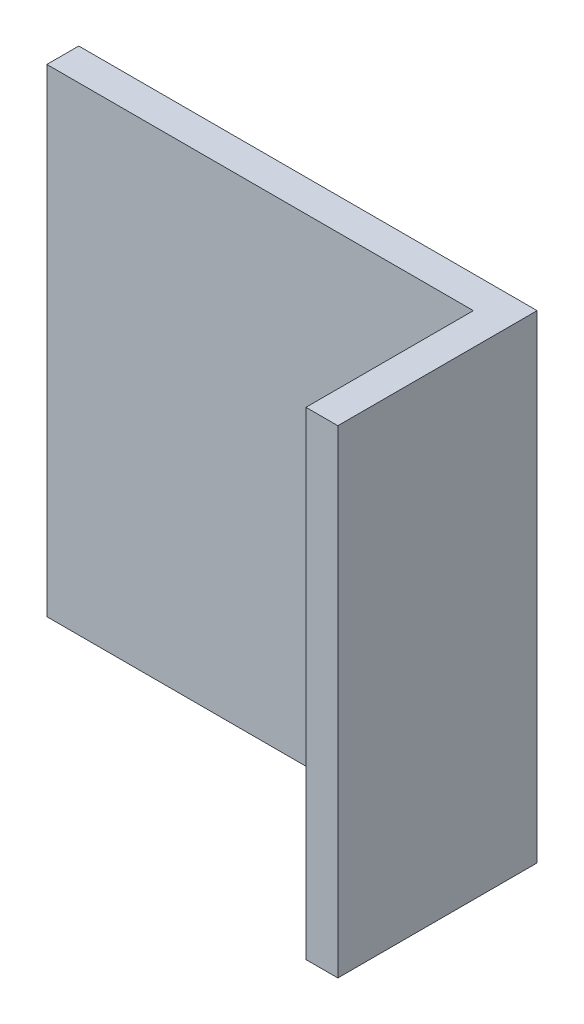
ISO-10303-21;
HEADER;
FILE_DESCRIPTION(('STEP AP214'),'2;1');
FILE_NAME('part.step','',(''),(''),'','','');
FILE_SCHEMA(('AUTOMOTIVE_DESIGN { 1 0 10303 214 1 1 1 1 }'));
ENDSEC;
DATA;
#1=APPLICATION_CONTEXT('core data for automotive mechanical design processes');
#2=APPLICATION_PROTOCOL_DEFINITION('international standard','automotive_design',2000,#1);
#3=PRODUCT_CONTEXT('',#1,'mechanical');
#4=PRODUCT('Part','Part','',(#3));
#5=PRODUCT_RELATED_PRODUCT_CATEGORY('part','',(#4));
#6=PRODUCT_DEFINITION_FORMATION('','',#4);
#7=PRODUCT_DEFINITION_CONTEXT('part definition',#1,'design');
#8=PRODUCT_DEFINITION('design','',#6,#7);
#9=PRODUCT_DEFINITION_SHAPE('','',#8);
#10=(LENGTH_UNIT() NAMED_UNIT(*) SI_UNIT(.MILLI.,.METRE.));
#11=(NAMED_UNIT(*) PLANE_ANGLE_UNIT() SI_UNIT($,.RADIAN.));
#12=(NAMED_UNIT(*) SI_UNIT($,.STERADIAN.) SOLID_ANGLE_UNIT());
#13=UNCERTAINTY_MEASURE_WITH_UNIT(LENGTH_MEASURE(1.E-05),#10,'distance_accuracy_value','');
#14=(GEOMETRIC_REPRESENTATION_CONTEXT(3) GLOBAL_UNCERTAINTY_ASSIGNED_CONTEXT((#13)) GLOBAL_UNIT_ASSIGNED_CONTEXT((#10,
#11,#12)) REPRESENTATION_CONTEXT('',''));
#15=CARTESIAN_POINT('',(0.,0.,0.));
#16=DIRECTION('',(0.,0.,1.));
#17=DIRECTION('',(1.,0.,0.));
#18=AXIS2_PLACEMENT_3D('',#15,#16,#17);
#19=CARTESIAN_POINT('',(-115.,-120.,16.));
#20=DIRECTION('',(1.,0.,0.));
#21=DIRECTION('',(0.,0.,-1.));
#22=AXIS2_PLACEMENT_3D('',#19,#20,#21);
#23=PLANE('',#22);
#24=DIRECTION('',(0.,-1.,0.));
#25=VECTOR('',#24,1.);
#26=CARTESIAN_POINT('',(-115.,-120.,0.));
#27=LINE('',#26,#25);
#28=CARTESIAN_POINT('',(-115.,120.,0.));
#29=VERTEX_POINT('',#28);
#30=CARTESIAN_POINT('',(-115.,-120.,0.));
#31=VERTEX_POINT('',#30);
#32=EDGE_CURVE('E92',#29,#31,#27,.T.);
#33=ORIENTED_EDGE('',*,*,#32,.T.);
#34=DIRECTION('',(0.,0.,-1.));
#35=VECTOR('',#34,1.);
#36=CARTESIAN_POINT('',(-115.,-120.,16.));
#37=LINE('',#36,#35);
#38=CARTESIAN_POINT('',(-115.,-120.,16.));
#39=VERTEX_POINT('',#38);
#40=EDGE_CURVE('E11',#39,#31,#37,.T.);
#41=ORIENTED_EDGE('',*,*,#40,.F.);
#42=DIRECTION('',(0.,-1.,0.));
#43=VECTOR('',#42,1.);
#44=CARTESIAN_POINT('',(-115.,-120.,16.));
#45=LINE('',#44,#43);
#46=CARTESIAN_POINT('',(-115.,120.,16.));
#47=VERTEX_POINT('',#46);
#48=EDGE_CURVE('E86',#47,#39,#45,.T.);
#49=ORIENTED_EDGE('',*,*,#48,.F.);
#50=DIRECTION('',(0.,0.,-1.));
#51=VECTOR('',#50,1.);
#52=CARTESIAN_POINT('',(-115.,120.,16.));
#53=LINE('',#52,#51);
#54=EDGE_CURVE('E78',#47,#29,#53,.T.);
#55=ORIENTED_EDGE('',*,*,#54,.T.);
#56=EDGE_LOOP('',(#33,#41,#49,#55));
#57=FACE_BOUND('',#56,.T.);
#58=ADVANCED_FACE('F34',(#57),#23,.F.);
#59=CARTESIAN_POINT('',(115.,-120.,16.));
#60=DIRECTION('',(0.,1.,0.));
#61=DIRECTION('',(-1.,0.,0.));
#62=AXIS2_PLACEMENT_3D('',#59,#60,#61);
#63=PLANE('',#62);
#64=DIRECTION('',(1.,0.,0.));
#65=VECTOR('',#64,1.);
#66=CARTESIAN_POINT('',(115.,-120.,0.));
#67=LINE('',#66,#65);
#68=CARTESIAN_POINT('',(115.,-120.,0.));
#69=VERTEX_POINT('',#68);
#70=EDGE_CURVE('E95',#31,#69,#67,.T.);
#71=ORIENTED_EDGE('',*,*,#70,.T.);
#72=DIRECTION('',(0.,0.,-1.));
#73=VECTOR('',#72,1.);
#74=CARTESIAN_POINT('',(115.,-120.,16.));
#75=LINE('',#74,#73);
#76=CARTESIAN_POINT('',(115.,-120.,100.));
#77=VERTEX_POINT('',#76);
#78=EDGE_CURVE('E42',#77,#69,#75,.T.);
#79=ORIENTED_EDGE('',*,*,#78,.F.);
#80=DIRECTION('',(1.,0.,0.));
#81=VECTOR('',#80,1.);
#82=CARTESIAN_POINT('',(115.,-120.,100.));
#83=LINE('',#82,#81);
#84=CARTESIAN_POINT('',(99.,-120.,100.));
#85=VERTEX_POINT('',#84);
#86=EDGE_CURVE('E117',#85,#77,#83,.T.);
#87=ORIENTED_EDGE('',*,*,#86,.F.);
#88=DIRECTION('',(0.,0.,-1.));
#89=VECTOR('',#88,1.);
#90=CARTESIAN_POINT('',(99.,-120.,100.));
#91=LINE('',#90,#89);
#92=CARTESIAN_POINT('',(99.,-120.,16.));
#93=VERTEX_POINT('',#92);
#94=EDGE_CURVE('E100',#85,#93,#91,.T.);
#95=ORIENTED_EDGE('',*,*,#94,.T.);
#96=DIRECTION('',(1.,0.,0.));
#97=VECTOR('',#96,1.);
#98=CARTESIAN_POINT('',(115.,-120.,16.));
#99=LINE('',#98,#97);
#100=EDGE_CURVE('E109',#39,#93,#99,.T.);
#101=ORIENTED_EDGE('',*,*,#100,.F.);
#102=ORIENTED_EDGE('',*,*,#40,.T.);
#103=EDGE_LOOP('',(#71,#79,#87,#95,#101,#102));
#104=FACE_BOUND('',#103,.T.);
#105=ADVANCED_FACE('F154',(#104),#63,.F.);
#106=CARTESIAN_POINT('',(115.,-120.,16.));
#107=DIRECTION('',(-1.,0.,0.));
#108=DIRECTION('',(0.,0.,1.));
#109=AXIS2_PLACEMENT_3D('',#106,#107,#108);
#110=PLANE('',#109);
#111=DIRECTION('',(0.,1.,0.));
#112=VECTOR('',#111,1.);
#113=CARTESIAN_POINT('',(115.,-120.,0.));
#114=LINE('',#113,#112);
#115=CARTESIAN_POINT('',(115.,120.,0.));
#116=VERTEX_POINT('',#115);
#117=EDGE_CURVE('E87',#69,#116,#114,.T.);
#118=ORIENTED_EDGE('',*,*,#117,.T.);
#119=DIRECTION('',(0.,0.,-1.));
#120=VECTOR('',#119,1.);
#121=CARTESIAN_POINT('',(115.,120.,16.));
#122=LINE('',#121,#120);
#123=CARTESIAN_POINT('',(115.,120.,100.));
#124=VERTEX_POINT('',#123);
#125=EDGE_CURVE('E82',#124,#116,#122,.T.);
#126=ORIENTED_EDGE('',*,*,#125,.F.);
#127=DIRECTION('',(0.,1.,0.));
#128=VECTOR('',#127,1.);
#129=CARTESIAN_POINT('',(115.,-120.,100.));
#130=LINE('',#129,#128);
#131=EDGE_CURVE('E120',#77,#124,#130,.T.);
#132=ORIENTED_EDGE('',*,*,#131,.F.);
#133=ORIENTED_EDGE('',*,*,#78,.T.);
#134=EDGE_LOOP('',(#118,#126,#132,#133));
#135=FACE_BOUND('',#134,.T.);
#136=ADVANCED_FACE('F146',(#135),#110,.F.);
#137=CARTESIAN_POINT('',(115.,120.,16.));
#138=DIRECTION('',(0.,-1.,0.));
#139=DIRECTION('',(1.,0.,0.));
#140=AXIS2_PLACEMENT_3D('',#137,#138,#139);
#141=PLANE('',#140);
#142=DIRECTION('',(-1.,0.,0.));
#143=VECTOR('',#142,1.);
#144=CARTESIAN_POINT('',(115.,120.,0.));
#145=LINE('',#144,#143);
#146=EDGE_CURVE('E75',#116,#29,#145,.T.);
#147=ORIENTED_EDGE('',*,*,#146,.T.);
#148=ORIENTED_EDGE('',*,*,#54,.F.);
#149=DIRECTION('',(-1.,0.,0.));
#150=VECTOR('',#149,1.);
#151=CARTESIAN_POINT('',(115.,120.,16.));
#152=LINE('',#151,#150);
#153=CARTESIAN_POINT('',(99.,120.,16.));
#154=VERTEX_POINT('',#153);
#155=EDGE_CURVE('E55',#154,#47,#152,.T.);
#156=ORIENTED_EDGE('',*,*,#155,.F.);
#157=DIRECTION('',(0.,0.,-1.));
#158=VECTOR('',#157,1.);
#159=CARTESIAN_POINT('',(99.,120.,100.));
#160=LINE('',#159,#158);
#161=CARTESIAN_POINT('',(99.,120.,100.));
#162=VERTEX_POINT('',#161);
#163=EDGE_CURVE('E96',#162,#154,#160,.T.);
#164=ORIENTED_EDGE('',*,*,#163,.F.);
#165=DIRECTION('',(-1.,0.,0.));
#166=VECTOR('',#165,1.);
#167=CARTESIAN_POINT('',(115.,120.,100.));
#168=LINE('',#167,#166);
#169=EDGE_CURVE('E134',#124,#162,#168,.T.);
#170=ORIENTED_EDGE('',*,*,#169,.F.);
#171=ORIENTED_EDGE('',*,*,#125,.T.);
#172=EDGE_LOOP('',(#147,#148,#156,#164,#170,#171));
#173=FACE_BOUND('',#172,.T.);
#174=ADVANCED_FACE('F77',(#173),#141,.F.);
#175=CARTESIAN_POINT('',(-115.,120.,16.));
#176=DIRECTION('',(0.,0.,1.));
#177=DIRECTION('',(1.,0.,0.));
#178=AXIS2_PLACEMENT_3D('',#175,#176,#177);
#179=PLANE('',#178);
#180=DIRECTION('',(0.,-1.,0.));
#181=VECTOR('',#180,1.);
#182=CARTESIAN_POINT('',(99.,-120.,16.));
#183=LINE('',#182,#181);
#184=EDGE_CURVE('E50',#154,#93,#183,.T.);
#185=ORIENTED_EDGE('',*,*,#184,.F.);
#186=ORIENTED_EDGE('',*,*,#155,.T.);
#187=ORIENTED_EDGE('',*,*,#48,.T.);
#188=ORIENTED_EDGE('',*,*,#100,.T.);
#189=EDGE_LOOP('',(#185,#186,#187,#188));
#190=FACE_BOUND('',#189,.T.);
#191=ADVANCED_FACE('F151',(#190),#179,.T.);
#192=CARTESIAN_POINT('',(-115.,120.,0.));
#193=DIRECTION('',(0.,0.,1.));
#194=DIRECTION('',(1.,0.,0.));
#195=AXIS2_PLACEMENT_3D('',#192,#193,#194);
#196=PLANE('',#195);
#197=ORIENTED_EDGE('',*,*,#32,.F.);
#198=ORIENTED_EDGE('',*,*,#146,.F.);
#199=ORIENTED_EDGE('',*,*,#117,.F.);
#200=ORIENTED_EDGE('',*,*,#70,.F.);
#201=EDGE_LOOP('',(#197,#198,#199,#200));
#202=FACE_BOUND('',#201,.T.);
#203=ADVANCED_FACE('F94',(#202),#196,.F.);
#204=CARTESIAN_POINT('',(99.,-120.,100.));
#205=DIRECTION('',(1.,0.,0.));
#206=DIRECTION('',(0.,0.,-1.));
#207=AXIS2_PLACEMENT_3D('',#204,#205,#206);
#208=PLANE('',#207);
#209=ORIENTED_EDGE('',*,*,#184,.T.);
#210=ORIENTED_EDGE('',*,*,#94,.F.);
#211=DIRECTION('',(0.,-1.,0.));
#212=VECTOR('',#211,1.);
#213=CARTESIAN_POINT('',(99.,-120.,100.));
#214=LINE('',#213,#212);
#215=EDGE_CURVE('E129',#162,#85,#214,.T.);
#216=ORIENTED_EDGE('',*,*,#215,.F.);
#217=ORIENTED_EDGE('',*,*,#163,.T.);
#218=EDGE_LOOP('',(#209,#210,#216,#217));
#219=FACE_BOUND('',#218,.T.);
#220=ADVANCED_FACE('F153',(#219),#208,.F.);
#221=CARTESIAN_POINT('',(115.,120.,100.));
#222=DIRECTION('',(0.,0.,1.));
#223=DIRECTION('',(1.,0.,0.));
#224=AXIS2_PLACEMENT_3D('',#221,#222,#223);
#225=PLANE('',#224);
#226=ORIENTED_EDGE('',*,*,#131,.T.);
#227=ORIENTED_EDGE('',*,*,#169,.T.);
#228=ORIENTED_EDGE('',*,*,#215,.T.);
#229=ORIENTED_EDGE('',*,*,#86,.T.);
#230=EDGE_LOOP('',(#226,#227,#228,#229));
#231=FACE_BOUND('',#230,.T.);
#232=ADVANCED_FACE('F141',(#231),#225,.T.);
#233=CLOSED_SHELL('',(#58,#105,#136,#174,#191,#203,#220,#232));
#234=MANIFOLD_SOLID_BREP('B2',#233);
#235=ADVANCED_BREP_SHAPE_REPRESENTATION('',(#18,#234),#14);
#236=SHAPE_DEFINITION_REPRESENTATION(#9,#235);
ENDSEC;
END-ISO-10303-21;
